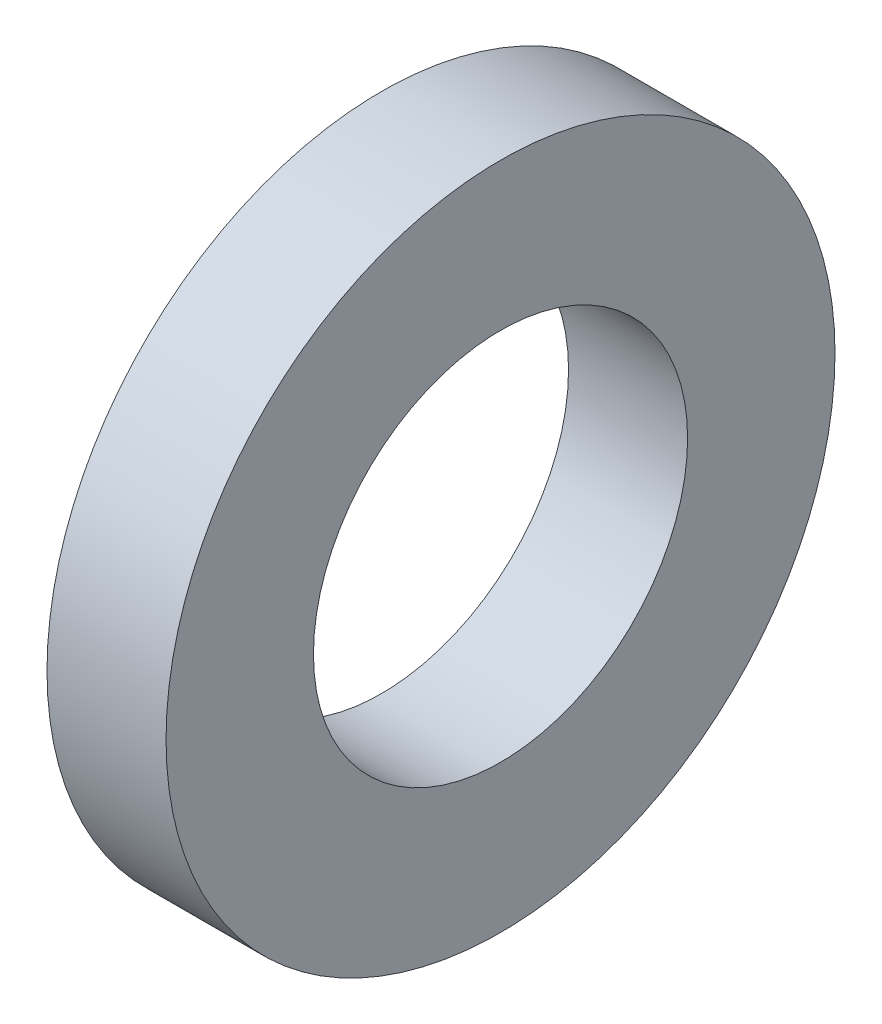
ISO-10303-21;
HEADER;
FILE_DESCRIPTION(('STEP AP214'),'2;1');
FILE_NAME('part.step','',(''),(''),'','','');
FILE_SCHEMA(('AUTOMOTIVE_DESIGN { 1 0 10303 214 1 1 1 1 }'));
ENDSEC;
DATA;
#1=APPLICATION_CONTEXT('core data for automotive mechanical design processes');
#2=APPLICATION_PROTOCOL_DEFINITION('international standard','automotive_design',2000,#1);
#3=PRODUCT_CONTEXT('',#1,'mechanical');
#4=PRODUCT('Part','Part','',(#3));
#5=PRODUCT_RELATED_PRODUCT_CATEGORY('part','',(#4));
#6=PRODUCT_DEFINITION_FORMATION('','',#4);
#7=PRODUCT_DEFINITION_CONTEXT('part definition',#1,'design');
#8=PRODUCT_DEFINITION('design','',#6,#7);
#9=PRODUCT_DEFINITION_SHAPE('','',#8);
#10=(LENGTH_UNIT() NAMED_UNIT(*) SI_UNIT(.MILLI.,.METRE.));
#11=(NAMED_UNIT(*) PLANE_ANGLE_UNIT() SI_UNIT($,.RADIAN.));
#12=(NAMED_UNIT(*) SI_UNIT($,.STERADIAN.) SOLID_ANGLE_UNIT());
#13=UNCERTAINTY_MEASURE_WITH_UNIT(LENGTH_MEASURE(1.E-05),#10,'distance_accuracy_value','');
#14=(GEOMETRIC_REPRESENTATION_CONTEXT(3) GLOBAL_UNCERTAINTY_ASSIGNED_CONTEXT((#13)) GLOBAL_UNIT_ASSIGNED_CONTEXT((#10,
#11,#12)) REPRESENTATION_CONTEXT('',''));
#15=CARTESIAN_POINT('',(0.,0.,0.));
#16=DIRECTION('',(0.,0.,1.));
#17=DIRECTION('',(1.,0.,0.));
#18=AXIS2_PLACEMENT_3D('',#15,#16,#17);
#19=CARTESIAN_POINT('',(0.,0.,0.));
#20=DIRECTION('',(1.,0.,0.));
#21=DIRECTION('',(0.,0.,-1.));
#22=AXIS2_PLACEMENT_3D('',#19,#20,#21);
#23=PLANE('',#22);
#24=CARTESIAN_POINT('',(0.,0.,0.));
#25=DIRECTION('',(-1.,0.,0.));
#26=DIRECTION('',(0.,0.,1.));
#27=AXIS2_PLACEMENT_3D('',#24,#25,#26);
#28=CIRCLE('',#27,3.3);
#29=CARTESIAN_POINT('',(0.,0.,3.3));
#30=VERTEX_POINT('',#29);
#31=EDGE_CURVE('E27',#30,#30,#28,.F.);
#32=ORIENTED_EDGE('',*,*,#31,.T.);
#33=EDGE_LOOP('',(#32));
#34=FACE_BOUND('',#33,.T.);
#35=CARTESIAN_POINT('',(0.,0.,0.));
#36=DIRECTION('',(-1.,0.,0.));
#37=DIRECTION('',(0.,0.,1.));
#38=AXIS2_PLACEMENT_3D('',#35,#36,#37);
#39=CIRCLE('',#38,5.9);
#40=CARTESIAN_POINT('',(0.,0.,5.9));
#41=VERTEX_POINT('',#40);
#42=EDGE_CURVE('E18',#41,#41,#39,.F.);
#43=ORIENTED_EDGE('',*,*,#42,.F.);
#44=EDGE_LOOP('',(#43));
#45=FACE_BOUND('',#44,.T.);
#46=ADVANCED_FACE('F15',(#34,#45),#23,.F.);
#47=CARTESIAN_POINT('',(2.1,0.,0.));
#48=DIRECTION('',(-1.,0.,0.));
#49=DIRECTION('',(0.,0.,1.));
#50=AXIS2_PLACEMENT_3D('',#47,#48,#49);
#51=CYLINDRICAL_SURFACE('',#50,5.9);
#52=ORIENTED_EDGE('',*,*,#42,.T.);
#53=EDGE_LOOP('',(#52));
#54=FACE_BOUND('',#53,.T.);
#55=CARTESIAN_POINT('',(2.1,0.,0.));
#56=DIRECTION('',(-1.,0.,0.));
#57=DIRECTION('',(0.,0.,1.));
#58=AXIS2_PLACEMENT_3D('',#55,#56,#57);
#59=CIRCLE('',#58,5.9);
#60=CARTESIAN_POINT('',(2.1,0.,5.9));
#61=VERTEX_POINT('',#60);
#62=EDGE_CURVE('E22',#61,#61,#59,.F.);
#63=ORIENTED_EDGE('',*,*,#62,.F.);
#64=EDGE_LOOP('',(#63));
#65=FACE_BOUND('',#64,.T.);
#66=ADVANCED_FACE('F35',(#54,#65),#51,.T.);
#67=CARTESIAN_POINT('',(2.1,0.,0.));
#68=DIRECTION('',(-1.,0.,0.));
#69=DIRECTION('',(0.,0.,1.));
#70=AXIS2_PLACEMENT_3D('',#67,#68,#69);
#71=CYLINDRICAL_SURFACE('',#70,3.3);
#72=CARTESIAN_POINT('',(2.1,0.,0.));
#73=DIRECTION('',(-1.,0.,0.));
#74=DIRECTION('',(0.,0.,1.));
#75=AXIS2_PLACEMENT_3D('',#72,#73,#74);
#76=CIRCLE('',#75,3.3);
#77=CARTESIAN_POINT('',(2.1,0.,3.3));
#78=VERTEX_POINT('',#77);
#79=EDGE_CURVE('E10',#78,#78,#76,.T.);
#80=ORIENTED_EDGE('',*,*,#79,.F.);
#81=EDGE_LOOP('',(#80));
#82=FACE_BOUND('',#81,.T.);
#83=ORIENTED_EDGE('',*,*,#31,.F.);
#84=EDGE_LOOP('',(#83));
#85=FACE_BOUND('',#84,.T.);
#86=ADVANCED_FACE('F43',(#82,#85),#71,.F.);
#87=CARTESIAN_POINT('',(2.1,0.,0.));
#88=DIRECTION('',(1.,0.,0.));
#89=DIRECTION('',(0.,0.,-1.));
#90=AXIS2_PLACEMENT_3D('',#87,#88,#89);
#91=PLANE('',#90);
#92=ORIENTED_EDGE('',*,*,#79,.T.);
#93=EDGE_LOOP('',(#92));
#94=FACE_BOUND('',#93,.T.);
#95=ORIENTED_EDGE('',*,*,#62,.T.);
#96=EDGE_LOOP('',(#95));
#97=FACE_BOUND('',#96,.T.);
#98=ADVANCED_FACE('F44',(#94,#97),#91,.T.);
#99=CLOSED_SHELL('',(#46,#66,#86,#98));
#100=MANIFOLD_SOLID_BREP('B1',#99);
#101=ADVANCED_BREP_SHAPE_REPRESENTATION('',(#18,#100),#14);
#102=SHAPE_DEFINITION_REPRESENTATION(#9,#101);
ENDSEC;
END-ISO-10303-21;
